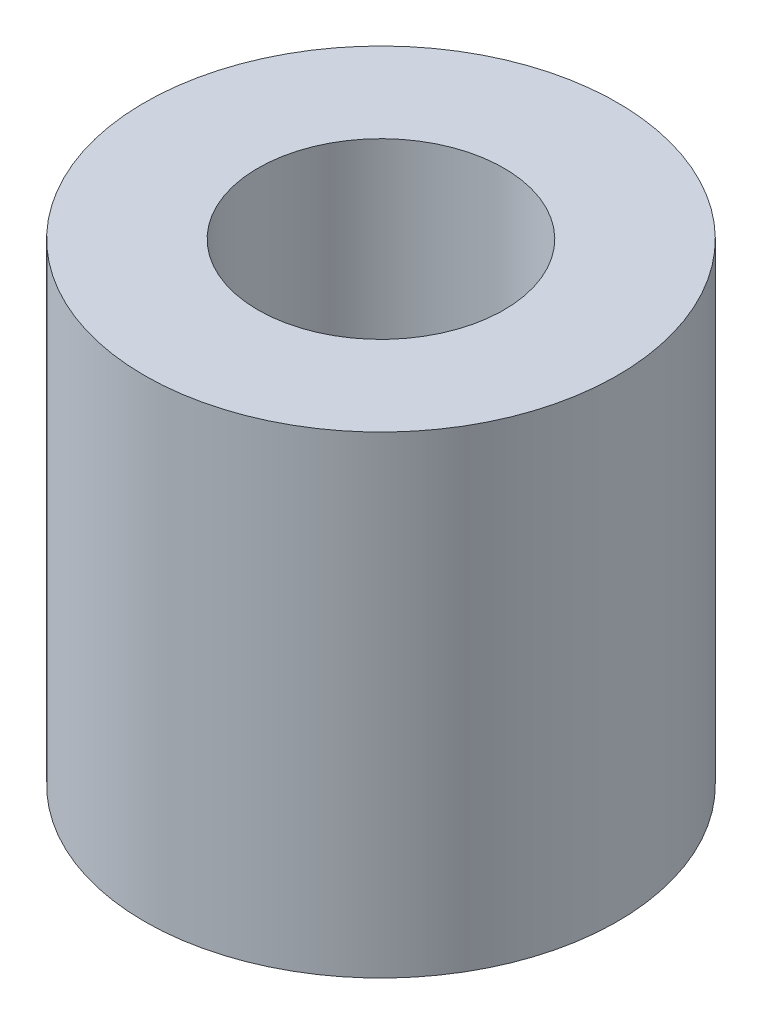
ISO-10303-21;
HEADER;
FILE_DESCRIPTION(('STEP AP214'),'2;1');
FILE_NAME('part.step','',(''),(''),'','','');
FILE_SCHEMA(('AUTOMOTIVE_DESIGN { 1 0 10303 214 1 1 1 1 }'));
ENDSEC;
DATA;
#1=APPLICATION_CONTEXT('core data for automotive mechanical design processes');
#2=APPLICATION_PROTOCOL_DEFINITION('international standard','automotive_design',2000,#1);
#3=PRODUCT_CONTEXT('',#1,'mechanical');
#4=PRODUCT('Part','Part','',(#3));
#5=PRODUCT_RELATED_PRODUCT_CATEGORY('part','',(#4));
#6=PRODUCT_DEFINITION_FORMATION('','',#4);
#7=PRODUCT_DEFINITION_CONTEXT('part definition',#1,'design');
#8=PRODUCT_DEFINITION('design','',#6,#7);
#9=PRODUCT_DEFINITION_SHAPE('','',#8);
#10=(LENGTH_UNIT() NAMED_UNIT(*) SI_UNIT(.MILLI.,.METRE.));
#11=(NAMED_UNIT(*) PLANE_ANGLE_UNIT() SI_UNIT($,.RADIAN.));
#12=(NAMED_UNIT(*) SI_UNIT($,.STERADIAN.) SOLID_ANGLE_UNIT());
#13=UNCERTAINTY_MEASURE_WITH_UNIT(LENGTH_MEASURE(1.E-05),#10,'distance_accuracy_value','');
#14=(GEOMETRIC_REPRESENTATION_CONTEXT(3) GLOBAL_UNCERTAINTY_ASSIGNED_CONTEXT((#13)) GLOBAL_UNIT_ASSIGNED_CONTEXT((#10,
#11,#12)) REPRESENTATION_CONTEXT('',''));
#15=CARTESIAN_POINT('',(0.,0.,0.));
#16=DIRECTION('',(0.,0.,1.));
#17=DIRECTION('',(1.,0.,0.));
#18=AXIS2_PLACEMENT_3D('',#15,#16,#17);
#19=CARTESIAN_POINT('',(0.,10.,0.));
#20=DIRECTION('',(0.,1.,0.));
#21=DIRECTION('',(0.,0.,1.));
#22=AXIS2_PLACEMENT_3D('',#19,#20,#21);
#23=PLANE('',#22);
#24=CARTESIAN_POINT('',(0.,10.,0.));
#25=DIRECTION('',(0.,1.,0.));
#26=DIRECTION('',(0.,0.,1.));
#27=AXIS2_PLACEMENT_3D('',#24,#25,#26);
#28=CIRCLE('',#27,5.);
#29=CARTESIAN_POINT('',(0.,10.,5.));
#30=VERTEX_POINT('',#29);
#31=EDGE_CURVE('E10',#30,#30,#28,.T.);
#32=ORIENTED_EDGE('',*,*,#31,.T.);
#33=EDGE_LOOP('',(#32));
#34=FACE_BOUND('',#33,.T.);
#35=CARTESIAN_POINT('',(0.,10.,0.));
#36=DIRECTION('',(0.,1.,0.));
#37=DIRECTION('',(0.,0.,1.));
#38=AXIS2_PLACEMENT_3D('',#35,#36,#37);
#39=CIRCLE('',#38,2.6);
#40=CARTESIAN_POINT('',(0.,10.,2.6));
#41=VERTEX_POINT('',#40);
#42=EDGE_CURVE('E41',#41,#41,#39,.T.);
#43=ORIENTED_EDGE('',*,*,#42,.F.);
#44=EDGE_LOOP('',(#43));
#45=FACE_BOUND('',#44,.T.);
#46=ADVANCED_FACE('F30',(#34,#45),#23,.T.);
#47=CARTESIAN_POINT('',(0.,0.,0.));
#48=DIRECTION('',(0.,1.,0.));
#49=DIRECTION('',(0.,0.,1.));
#50=AXIS2_PLACEMENT_3D('',#47,#48,#49);
#51=PLANE('',#50);
#52=CARTESIAN_POINT('',(0.,0.,0.));
#53=DIRECTION('',(0.,1.,0.));
#54=DIRECTION('',(0.,0.,1.));
#55=AXIS2_PLACEMENT_3D('',#52,#53,#54);
#56=CIRCLE('',#55,5.);
#57=CARTESIAN_POINT('',(0.,0.,5.));
#58=VERTEX_POINT('',#57);
#59=EDGE_CURVE('E34',#58,#58,#56,.T.);
#60=ORIENTED_EDGE('',*,*,#59,.F.);
#61=EDGE_LOOP('',(#60));
#62=FACE_BOUND('',#61,.T.);
#63=CARTESIAN_POINT('',(0.,0.,0.));
#64=DIRECTION('',(0.,1.,0.));
#65=DIRECTION('',(0.,0.,1.));
#66=AXIS2_PLACEMENT_3D('',#63,#64,#65);
#67=CIRCLE('',#66,2.6);
#68=CARTESIAN_POINT('',(0.,0.,2.6));
#69=VERTEX_POINT('',#68);
#70=EDGE_CURVE('E43',#69,#69,#67,.T.);
#71=ORIENTED_EDGE('',*,*,#70,.T.);
#72=EDGE_LOOP('',(#71));
#73=FACE_BOUND('',#72,.T.);
#74=ADVANCED_FACE('F53',(#62,#73),#51,.F.);
#75=CARTESIAN_POINT('',(0.,10.,0.));
#76=DIRECTION('',(0.,-1.,0.));
#77=DIRECTION('',(0.,0.,-1.));
#78=AXIS2_PLACEMENT_3D('',#75,#76,#77);
#79=CYLINDRICAL_SURFACE('',#78,5.);
#80=ORIENTED_EDGE('',*,*,#31,.F.);
#81=EDGE_LOOP('',(#80));
#82=FACE_BOUND('',#81,.T.);
#83=ORIENTED_EDGE('',*,*,#59,.T.);
#84=EDGE_LOOP('',(#83));
#85=FACE_BOUND('',#84,.T.);
#86=ADVANCED_FACE('F32',(#82,#85),#79,.T.);
#87=CARTESIAN_POINT('',(0.,10.,0.));
#88=DIRECTION('',(0.,-1.,0.));
#89=DIRECTION('',(0.,0.,-1.));
#90=AXIS2_PLACEMENT_3D('',#87,#88,#89);
#91=CYLINDRICAL_SURFACE('',#90,2.6);
#92=ORIENTED_EDGE('',*,*,#42,.T.);
#93=EDGE_LOOP('',(#92));
#94=FACE_BOUND('',#93,.T.);
#95=ORIENTED_EDGE('',*,*,#70,.F.);
#96=EDGE_LOOP('',(#95));
#97=FACE_BOUND('',#96,.T.);
#98=ADVANCED_FACE('F49',(#94,#97),#91,.F.);
#99=CLOSED_SHELL('',(#46,#74,#86,#98));
#100=MANIFOLD_SOLID_BREP('B2',#99);
#101=ADVANCED_BREP_SHAPE_REPRESENTATION('',(#18,#100),#14);
#102=SHAPE_DEFINITION_REPRESENTATION(#9,#101);
ENDSEC;
END-ISO-10303-21;
